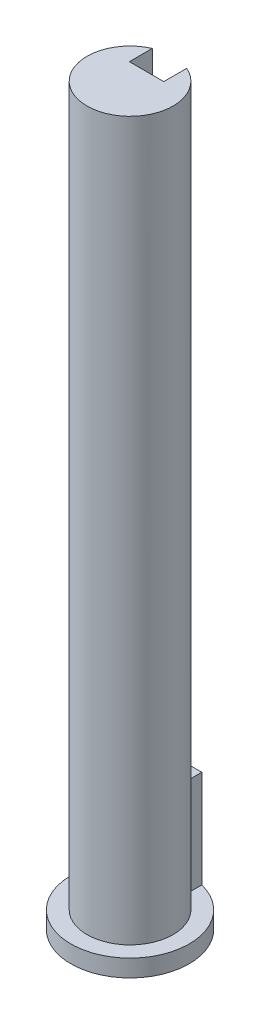
ISO-10303-21;
HEADER;
FILE_DESCRIPTION(('STEP AP214'),'2;1');
FILE_NAME('part.step','',(''),(''),'','','');
FILE_SCHEMA(('AUTOMOTIVE_DESIGN { 1 0 10303 214 1 1 1 1 }'));
ENDSEC;
DATA;
#1=APPLICATION_CONTEXT('core data for automotive mechanical design processes');
#2=APPLICATION_PROTOCOL_DEFINITION('international standard','automotive_design',2000,#1);
#3=PRODUCT_CONTEXT('',#1,'mechanical');
#4=PRODUCT('Part','Part','',(#3));
#5=PRODUCT_RELATED_PRODUCT_CATEGORY('part','',(#4));
#6=PRODUCT_DEFINITION_FORMATION('','',#4);
#7=PRODUCT_DEFINITION_CONTEXT('part definition',#1,'design');
#8=PRODUCT_DEFINITION('design','',#6,#7);
#9=PRODUCT_DEFINITION_SHAPE('','',#8);
#10=(LENGTH_UNIT() NAMED_UNIT(*) SI_UNIT(.MILLI.,.METRE.));
#11=(NAMED_UNIT(*) PLANE_ANGLE_UNIT() SI_UNIT($,.RADIAN.));
#12=(NAMED_UNIT(*) SI_UNIT($,.STERADIAN.) SOLID_ANGLE_UNIT());
#13=UNCERTAINTY_MEASURE_WITH_UNIT(LENGTH_MEASURE(1.E-05),#10,'distance_accuracy_value','');
#14=(GEOMETRIC_REPRESENTATION_CONTEXT(3) GLOBAL_UNCERTAINTY_ASSIGNED_CONTEXT((#13)) GLOBAL_UNIT_ASSIGNED_CONTEXT((#10,
#11,#12)) REPRESENTATION_CONTEXT('',''));
#15=CARTESIAN_POINT('',(0.,0.,0.));
#16=DIRECTION('',(0.,0.,1.));
#17=DIRECTION('',(1.,0.,0.));
#18=AXIS2_PLACEMENT_3D('',#15,#16,#17);
#19=CARTESIAN_POINT('',(0.,50.,0.));
#20=DIRECTION('',(0.,-1.,0.));
#21=DIRECTION('',(0.,0.,-1.));
#22=AXIS2_PLACEMENT_3D('',#19,#20,#21);
#23=CYLINDRICAL_SURFACE('',#22,3.);
#24=CARTESIAN_POINT('',(0.,50.,0.));
#25=DIRECTION('',(0.,1.,0.));
#26=DIRECTION('',(0.,0.,1.));
#27=AXIS2_PLACEMENT_3D('',#24,#25,#26);
#28=CIRCLE('',#27,3.);
#29=CARTESIAN_POINT('',(-1.2,50.,-2.7495454169735));
#30=VERTEX_POINT('',#29);
#31=CARTESIAN_POINT('',(1.2,50.,-2.7495454169735));
#32=VERTEX_POINT('',#31);
#33=EDGE_CURVE('E42',#30,#32,#28,.T.);
#34=ORIENTED_EDGE('',*,*,#33,.F.);
#35=DIRECTION('',(0.,1.,0.));
#36=VECTOR('',#35,1.);
#37=CARTESIAN_POINT('',(-1.2,12.8,-2.7495454169735));
#38=LINE('',#37,#36);
#39=CARTESIAN_POINT('',(-1.2,12.8,-2.7495454169735));
#40=VERTEX_POINT('',#39);
#41=EDGE_CURVE('E120',#40,#30,#38,.T.);
#42=ORIENTED_EDGE('',*,*,#41,.F.);
#43=CARTESIAN_POINT('',(0.,12.8,0.));
#44=DIRECTION('',(0.,-1.,0.));
#45=DIRECTION('',(0.,0.,-1.));
#46=AXIS2_PLACEMENT_3D('',#43,#44,#45);
#47=CIRCLE('',#46,3.);
#48=CARTESIAN_POINT('',(1.2,12.8,-2.7495454169735));
#49=VERTEX_POINT('',#48);
#50=EDGE_CURVE('E11',#40,#49,#47,.T.);
#51=ORIENTED_EDGE('',*,*,#50,.T.);
#52=DIRECTION('',(0.,1.,0.));
#53=VECTOR('',#52,1.);
#54=CARTESIAN_POINT('',(1.2,12.8,-2.7495454169735));
#55=LINE('',#54,#53);
#56=EDGE_CURVE('E124',#49,#32,#55,.T.);
#57=ORIENTED_EDGE('',*,*,#56,.T.);
#58=EDGE_LOOP('',(#34,#42,#51,#57));
#59=FACE_BOUND('',#58,.T.);
#60=CARTESIAN_POINT('',(0.,0.,0.));
#61=DIRECTION('',(0.,1.,0.));
#62=DIRECTION('',(0.,0.,1.));
#63=AXIS2_PLACEMENT_3D('',#60,#61,#62);
#64=CIRCLE('',#63,3.);
#65=CARTESIAN_POINT('',(-1.,0.,-2.82842712474619));
#66=VERTEX_POINT('',#65);
#67=CARTESIAN_POINT('',(1.,0.,-2.82842712474619));
#68=VERTEX_POINT('',#67);
#69=EDGE_CURVE('E107',#66,#68,#64,.T.);
#70=ORIENTED_EDGE('',*,*,#69,.T.);
#71=DIRECTION('',(0.,-1.,0.));
#72=VECTOR('',#71,1.);
#73=CARTESIAN_POINT('',(1.,6.8,-2.82842712474619));
#74=LINE('',#73,#72);
#75=CARTESIAN_POINT('',(1.,6.8,-2.82842712474619));
#76=VERTEX_POINT('',#75);
#77=EDGE_CURVE('E99',#76,#68,#74,.T.);
#78=ORIENTED_EDGE('',*,*,#77,.F.);
#79=CARTESIAN_POINT('',(0.,6.8,0.));
#80=DIRECTION('',(0.,1.,0.));
#81=DIRECTION('',(0.,0.,1.));
#82=AXIS2_PLACEMENT_3D('',#79,#80,#81);
#83=CIRCLE('',#82,3.);
#84=CARTESIAN_POINT('',(-1.,6.8,-2.82842712474619));
#85=VERTEX_POINT('',#84);
#86=EDGE_CURVE('E57',#76,#85,#83,.T.);
#87=ORIENTED_EDGE('',*,*,#86,.T.);
#88=DIRECTION('',(0.,-1.,0.));
#89=VECTOR('',#88,1.);
#90=CARTESIAN_POINT('',(-1.,6.8,-2.82842712474619));
#91=LINE('',#90,#89);
#92=EDGE_CURVE('E111',#85,#66,#91,.T.);
#93=ORIENTED_EDGE('',*,*,#92,.T.);
#94=EDGE_LOOP('',(#70,#78,#87,#93));
#95=FACE_BOUND('',#94,.T.);
#96=ADVANCED_FACE('F35',(#59,#95),#23,.T.);
#97=CARTESIAN_POINT('',(0.,50.,0.));
#98=DIRECTION('',(0.,1.,0.));
#99=DIRECTION('',(0.,0.,1.));
#100=AXIS2_PLACEMENT_3D('',#97,#98,#99);
#101=PLANE('',#100);
#102=DIRECTION('',(0.,0.,1.));
#103=VECTOR('',#102,1.);
#104=CARTESIAN_POINT('',(-1.2,50.,-1.1495454169735));
#105=LINE('',#104,#103);
#106=CARTESIAN_POINT('',(-1.2,50.,-1.1495454169735));
#107=VERTEX_POINT('',#106);
#108=EDGE_CURVE('E49',#30,#107,#105,.T.);
#109=ORIENTED_EDGE('',*,*,#108,.F.);
#110=ORIENTED_EDGE('',*,*,#33,.T.);
#111=DIRECTION('',(0.,0.,-1.));
#112=VECTOR('',#111,1.);
#113=CARTESIAN_POINT('',(1.2,50.,-1.1495454169735));
#114=LINE('',#113,#112);
#115=CARTESIAN_POINT('',(1.2,50.,-1.1495454169735));
#116=VERTEX_POINT('',#115);
#117=EDGE_CURVE('E141',#116,#32,#114,.T.);
#118=ORIENTED_EDGE('',*,*,#117,.F.);
#119=DIRECTION('',(1.,0.,0.));
#120=VECTOR('',#119,1.);
#121=CARTESIAN_POINT('',(-1.2,50.,-1.1495454169735));
#122=LINE('',#121,#120);
#123=EDGE_CURVE('E213',#107,#116,#122,.T.);
#124=ORIENTED_EDGE('',*,*,#123,.F.);
#125=EDGE_LOOP('',(#109,#110,#118,#124));
#126=FACE_BOUND('',#125,.T.);
#127=ADVANCED_FACE('F139',(#126),#101,.T.);
#128=CARTESIAN_POINT('',(0.999999999999999,6.8,0.));
#129=DIRECTION('',(1.,0.,0.));
#130=DIRECTION('',(0.,0.,-1.));
#131=AXIS2_PLACEMENT_3D('',#128,#129,#130);
#132=PLANE('',#131);
#133=DIRECTION('',(0.,0.,1.));
#134=VECTOR('',#133,1.);
#135=CARTESIAN_POINT('',(0.999999999999999,0.,0.));
#136=LINE('',#135,#134);
#137=CARTESIAN_POINT('',(1.,0.,-4.));
#138=VERTEX_POINT('',#137);
#139=EDGE_CURVE('E103',#138,#68,#136,.T.);
#140=ORIENTED_EDGE('',*,*,#139,.F.);
#141=DIRECTION('',(0.,-1.,0.));
#142=VECTOR('',#141,1.);
#143=CARTESIAN_POINT('',(1.,6.8,-4.));
#144=LINE('',#143,#142);
#145=CARTESIAN_POINT('',(1.,6.8,-4.));
#146=VERTEX_POINT('',#145);
#147=EDGE_CURVE('E108',#146,#138,#144,.T.);
#148=ORIENTED_EDGE('',*,*,#147,.F.);
#149=DIRECTION('',(0.,0.,1.));
#150=VECTOR('',#149,1.);
#151=CARTESIAN_POINT('',(0.999999999999999,6.8,0.));
#152=LINE('',#151,#150);
#153=EDGE_CURVE('E106',#146,#76,#152,.T.);
#154=ORIENTED_EDGE('',*,*,#153,.T.);
#155=ORIENTED_EDGE('',*,*,#77,.T.);
#156=EDGE_LOOP('',(#140,#148,#154,#155));
#157=FACE_BOUND('',#156,.T.);
#158=ADVANCED_FACE('F101',(#157),#132,.T.);
#159=CARTESIAN_POINT('',(0.,6.8,-4.));
#160=DIRECTION('',(0.,0.,-1.));
#161=DIRECTION('',(-1.,0.,0.));
#162=AXIS2_PLACEMENT_3D('',#159,#160,#161);
#163=PLANE('',#162);
#164=DIRECTION('',(1.,0.,0.));
#165=VECTOR('',#164,1.);
#166=CARTESIAN_POINT('',(0.,0.,-4.));
#167=LINE('',#166,#165);
#168=CARTESIAN_POINT('',(-1.,0.,-4.));
#169=VERTEX_POINT('',#168);
#170=EDGE_CURVE('E119',#169,#138,#167,.T.);
#171=ORIENTED_EDGE('',*,*,#170,.F.);
#172=DIRECTION('',(0.,-1.,0.));
#173=VECTOR('',#172,1.);
#174=CARTESIAN_POINT('',(-1.,6.8,-4.));
#175=LINE('',#174,#173);
#176=CARTESIAN_POINT('',(-1.,6.8,-4.));
#177=VERTEX_POINT('',#176);
#178=EDGE_CURVE('E132',#177,#169,#175,.T.);
#179=ORIENTED_EDGE('',*,*,#178,.F.);
#180=DIRECTION('',(1.,0.,0.));
#181=VECTOR('',#180,1.);
#182=CARTESIAN_POINT('',(0.,6.8,-4.));
#183=LINE('',#182,#181);
#184=EDGE_CURVE('E157',#177,#146,#183,.T.);
#185=ORIENTED_EDGE('',*,*,#184,.T.);
#186=ORIENTED_EDGE('',*,*,#147,.T.);
#187=EDGE_LOOP('',(#171,#179,#185,#186));
#188=FACE_BOUND('',#187,.T.);
#189=ADVANCED_FACE('F178',(#188),#163,.T.);
#190=CARTESIAN_POINT('',(-1.,6.8,0.));
#191=DIRECTION('',(-1.,0.,0.));
#192=DIRECTION('',(0.,0.,1.));
#193=AXIS2_PLACEMENT_3D('',#190,#191,#192);
#194=PLANE('',#193);
#195=DIRECTION('',(0.,0.,-1.));
#196=VECTOR('',#195,1.);
#197=CARTESIAN_POINT('',(-1.,0.,0.));
#198=LINE('',#197,#196);
#199=EDGE_CURVE('E122',#66,#169,#198,.T.);
#200=ORIENTED_EDGE('',*,*,#199,.F.);
#201=ORIENTED_EDGE('',*,*,#92,.F.);
#202=DIRECTION('',(0.,0.,-1.));
#203=VECTOR('',#202,1.);
#204=CARTESIAN_POINT('',(-1.,6.8,0.));
#205=LINE('',#204,#203);
#206=EDGE_CURVE('E127',#85,#177,#205,.T.);
#207=ORIENTED_EDGE('',*,*,#206,.T.);
#208=ORIENTED_EDGE('',*,*,#178,.T.);
#209=EDGE_LOOP('',(#200,#201,#207,#208));
#210=FACE_BOUND('',#209,.T.);
#211=ADVANCED_FACE('F164',(#210),#194,.T.);
#212=CARTESIAN_POINT('',(0.,6.8,0.));
#213=DIRECTION('',(0.,1.,0.));
#214=DIRECTION('',(0.,0.,1.));
#215=AXIS2_PLACEMENT_3D('',#212,#213,#214);
#216=PLANE('',#215);
#217=ORIENTED_EDGE('',*,*,#86,.F.);
#218=ORIENTED_EDGE('',*,*,#153,.F.);
#219=ORIENTED_EDGE('',*,*,#184,.F.);
#220=ORIENTED_EDGE('',*,*,#206,.F.);
#221=EDGE_LOOP('',(#217,#218,#219,#220));
#222=FACE_BOUND('',#221,.T.);
#223=ADVANCED_FACE('F167',(#222),#216,.T.);
#224=CARTESIAN_POINT('',(0.,12.8,0.));
#225=DIRECTION('',(0.,-1.,0.));
#226=DIRECTION('',(0.,0.,-1.));
#227=AXIS2_PLACEMENT_3D('',#224,#225,#226);
#228=PLANE('',#227);
#229=DIRECTION('',(0.,0.,1.));
#230=VECTOR('',#229,1.);
#231=CARTESIAN_POINT('',(-1.2,12.8,-1.1495454169735));
#232=LINE('',#231,#230);
#233=CARTESIAN_POINT('',(-1.2,12.8,-1.1495454169735));
#234=VERTEX_POINT('',#233);
#235=EDGE_CURVE('E205',#40,#234,#232,.T.);
#236=ORIENTED_EDGE('',*,*,#235,.T.);
#237=DIRECTION('',(1.,0.,0.));
#238=VECTOR('',#237,1.);
#239=CARTESIAN_POINT('',(-1.2,12.8,-1.1495454169735));
#240=LINE('',#239,#238);
#241=CARTESIAN_POINT('',(1.2,12.8,-1.1495454169735));
#242=VERTEX_POINT('',#241);
#243=EDGE_CURVE('E208',#234,#242,#240,.T.);
#244=ORIENTED_EDGE('',*,*,#243,.T.);
#245=DIRECTION('',(0.,0.,-1.));
#246=VECTOR('',#245,1.);
#247=CARTESIAN_POINT('',(1.2,12.8,-1.1495454169735));
#248=LINE('',#247,#246);
#249=EDGE_CURVE('E155',#242,#49,#248,.T.);
#250=ORIENTED_EDGE('',*,*,#249,.T.);
#251=ORIENTED_EDGE('',*,*,#50,.F.);
#252=EDGE_LOOP('',(#236,#244,#250,#251));
#253=FACE_BOUND('',#252,.T.);
#254=ADVANCED_FACE('F169',(#253),#228,.F.);
#255=CARTESIAN_POINT('',(-1.2,12.8,-1.1495454169735));
#256=DIRECTION('',(-1.,0.,0.));
#257=DIRECTION('',(0.,0.,1.));
#258=AXIS2_PLACEMENT_3D('',#255,#256,#257);
#259=PLANE('',#258);
#260=ORIENTED_EDGE('',*,*,#108,.T.);
#261=DIRECTION('',(0.,1.,0.));
#262=VECTOR('',#261,1.);
#263=CARTESIAN_POINT('',(-1.2,12.8,-1.1495454169735));
#264=LINE('',#263,#262);
#265=EDGE_CURVE('E150',#234,#107,#264,.T.);
#266=ORIENTED_EDGE('',*,*,#265,.F.);
#267=ORIENTED_EDGE('',*,*,#235,.F.);
#268=ORIENTED_EDGE('',*,*,#41,.T.);
#269=EDGE_LOOP('',(#260,#266,#267,#268));
#270=FACE_BOUND('',#269,.T.);
#271=ADVANCED_FACE('F175',(#270),#259,.F.);
#272=CARTESIAN_POINT('',(1.2,12.8,-1.1495454169735));
#273=DIRECTION('',(1.,0.,0.));
#274=DIRECTION('',(0.,0.,-1.));
#275=AXIS2_PLACEMENT_3D('',#272,#273,#274);
#276=PLANE('',#275);
#277=ORIENTED_EDGE('',*,*,#117,.T.);
#278=ORIENTED_EDGE('',*,*,#56,.F.);
#279=ORIENTED_EDGE('',*,*,#249,.F.);
#280=DIRECTION('',(0.,1.,0.));
#281=VECTOR('',#280,1.);
#282=CARTESIAN_POINT('',(1.2,12.8,-1.1495454169735));
#283=LINE('',#282,#281);
#284=EDGE_CURVE('E148',#242,#116,#283,.T.);
#285=ORIENTED_EDGE('',*,*,#284,.T.);
#286=EDGE_LOOP('',(#277,#278,#279,#285));
#287=FACE_BOUND('',#286,.T.);
#288=ADVANCED_FACE('F215',(#287),#276,.F.);
#289=CARTESIAN_POINT('',(-1.2,12.8,-1.1495454169735));
#290=DIRECTION('',(0.,0.,1.));
#291=DIRECTION('',(1.,0.,0.));
#292=AXIS2_PLACEMENT_3D('',#289,#290,#291);
#293=PLANE('',#292);
#294=ORIENTED_EDGE('',*,*,#123,.T.);
#295=ORIENTED_EDGE('',*,*,#284,.F.);
#296=ORIENTED_EDGE('',*,*,#243,.F.);
#297=ORIENTED_EDGE('',*,*,#265,.T.);
#298=EDGE_LOOP('',(#294,#295,#296,#297));
#299=FACE_BOUND('',#298,.T.);
#300=ADVANCED_FACE('F218',(#299),#293,.F.);
#301=CARTESIAN_POINT('',(0.,0.,0.));
#302=DIRECTION('',(0.,-1.,0.));
#303=DIRECTION('',(0.,0.,-1.));
#304=AXIS2_PLACEMENT_3D('',#301,#302,#303);
#305=PLANE('',#304);
#306=ORIENTED_EDGE('',*,*,#69,.F.);
#307=ORIENTED_EDGE('',*,*,#199,.T.);
#308=CARTESIAN_POINT('',(0.,0.,0.));
#309=DIRECTION('',(0.,-1.,0.));
#310=DIRECTION('',(0.,0.,-1.));
#311=AXIS2_PLACEMENT_3D('',#308,#309,#310);
#312=CIRCLE('',#311,4.12310562561766);
#313=EDGE_CURVE('E118',#138,#169,#312,.T.);
#314=ORIENTED_EDGE('',*,*,#313,.F.);
#315=ORIENTED_EDGE('',*,*,#139,.T.);
#316=EDGE_LOOP('',(#306,#307,#314,#315));
#317=FACE_BOUND('',#316,.T.);
#318=ADVANCED_FACE('F116',(#317),#305,.F.);
#319=CARTESIAN_POINT('',(0.,-1.2,0.));
#320=DIRECTION('',(0.,1.,0.));
#321=DIRECTION('',(0.,0.,1.));
#322=AXIS2_PLACEMENT_3D('',#319,#320,#321);
#323=CYLINDRICAL_SURFACE('',#322,4.12310562561766);
#324=CARTESIAN_POINT('',(0.,-1.2,0.));
#325=DIRECTION('',(0.,-1.,0.));
#326=DIRECTION('',(0.,0.,-1.));
#327=AXIS2_PLACEMENT_3D('',#324,#325,#326);
#328=CIRCLE('',#327,4.12310562561766);
#329=CARTESIAN_POINT('',(0.,-1.2,-4.12310562561766));
#330=VERTEX_POINT('',#329);
#331=EDGE_CURVE('E201',#330,#330,#328,.T.);
#332=ORIENTED_EDGE('',*,*,#331,.F.);
#333=EDGE_LOOP('',(#332));
#334=FACE_BOUND('',#333,.T.);
#335=ORIENTED_EDGE('',*,*,#313,.T.);
#336=EDGE_CURVE('E196',#169,#138,#312,.T.);
#337=ORIENTED_EDGE('',*,*,#336,.T.);
#338=EDGE_LOOP('',(#335,#337));
#339=FACE_BOUND('',#338,.T.);
#340=ADVANCED_FACE('F200',(#334,#339),#323,.T.);
#341=CARTESIAN_POINT('',(0.,-1.2,0.));
#342=DIRECTION('',(0.,-1.,0.));
#343=DIRECTION('',(0.,0.,-1.));
#344=AXIS2_PLACEMENT_3D('',#341,#342,#343);
#345=PLANE('',#344);
#346=ORIENTED_EDGE('',*,*,#331,.T.);
#347=EDGE_LOOP('',(#346));
#348=FACE_BOUND('',#347,.T.);
#349=ADVANCED_FACE('F230',(#348),#345,.T.);
#350=ORIENTED_EDGE('',*,*,#336,.F.);
#351=ORIENTED_EDGE('',*,*,#170,.T.);
#352=EDGE_LOOP('',(#350,#351));
#353=FACE_BOUND('',#352,.T.);
#354=ADVANCED_FACE('F197',(#353),#305,.F.);
#355=CLOSED_SHELL('',(#96,#127,#158,#189,#211,#223,#254,#271,#288,#300,#318,#340,#349,#354));
#356=MANIFOLD_SOLID_BREP('B2',#355);
#357=ADVANCED_BREP_SHAPE_REPRESENTATION('',(#18,#356),#14);
#358=SHAPE_DEFINITION_REPRESENTATION(#9,#357);
ENDSEC;
END-ISO-10303-21;
